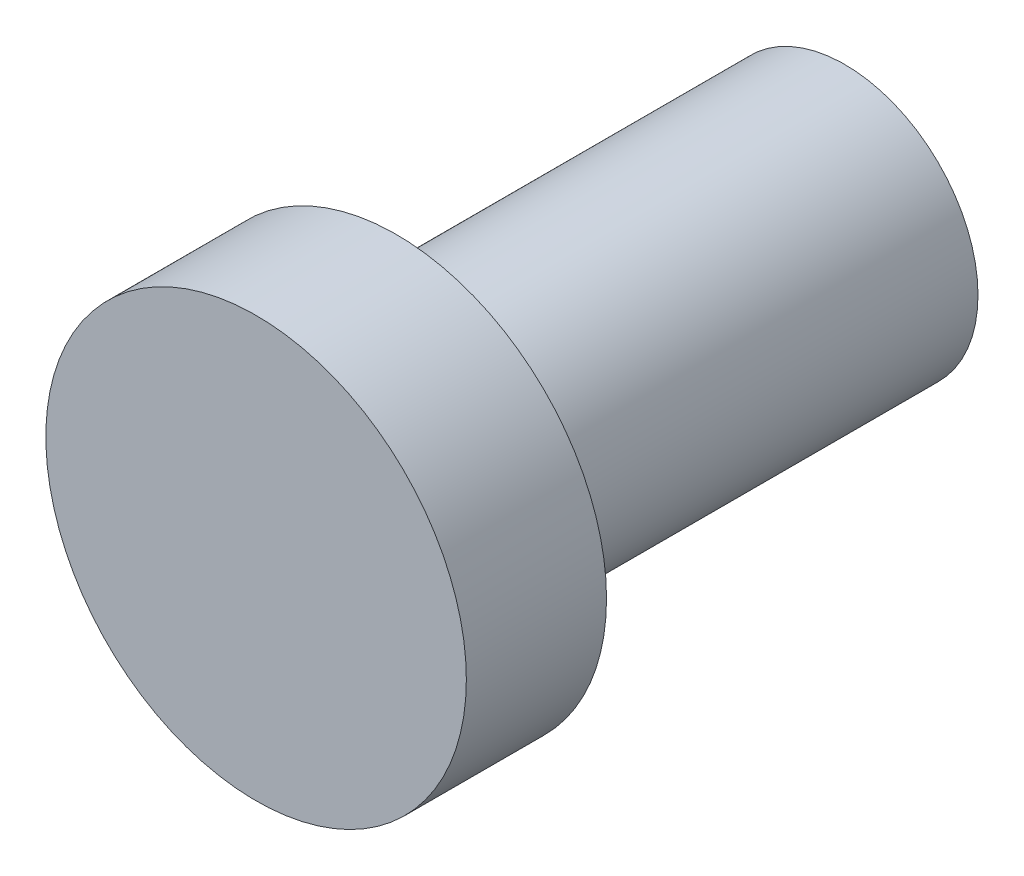
ISO-10303-21;
HEADER;
FILE_DESCRIPTION(('STEP AP214'),'2;1');
FILE_NAME('part.step','',(''),(''),'','','');
FILE_SCHEMA(('AUTOMOTIVE_DESIGN { 1 0 10303 214 1 1 1 1 }'));
ENDSEC;
DATA;
#1=APPLICATION_CONTEXT('core data for automotive mechanical design processes');
#2=APPLICATION_PROTOCOL_DEFINITION('international standard','automotive_design',2000,#1);
#3=PRODUCT_CONTEXT('',#1,'mechanical');
#4=PRODUCT('Part','Part','',(#3));
#5=PRODUCT_RELATED_PRODUCT_CATEGORY('part','',(#4));
#6=PRODUCT_DEFINITION_FORMATION('','',#4);
#7=PRODUCT_DEFINITION_CONTEXT('part definition',#1,'design');
#8=PRODUCT_DEFINITION('design','',#6,#7);
#9=PRODUCT_DEFINITION_SHAPE('','',#8);
#10=(LENGTH_UNIT() NAMED_UNIT(*) SI_UNIT(.MILLI.,.METRE.));
#11=(NAMED_UNIT(*) PLANE_ANGLE_UNIT() SI_UNIT($,.RADIAN.));
#12=(NAMED_UNIT(*) SI_UNIT($,.STERADIAN.) SOLID_ANGLE_UNIT());
#13=UNCERTAINTY_MEASURE_WITH_UNIT(LENGTH_MEASURE(1.E-05),#10,'distance_accuracy_value','');
#14=(GEOMETRIC_REPRESENTATION_CONTEXT(3) GLOBAL_UNCERTAINTY_ASSIGNED_CONTEXT((#13)) GLOBAL_UNIT_ASSIGNED_CONTEXT((#10,
#11,#12)) REPRESENTATION_CONTEXT('',''));
#15=CARTESIAN_POINT('',(0.,0.,0.));
#16=DIRECTION('',(0.,0.,1.));
#17=DIRECTION('',(1.,0.,0.));
#18=AXIS2_PLACEMENT_3D('',#15,#16,#17);
#19=CARTESIAN_POINT('',(0.,0.,16.));
#20=DIRECTION('',(0.,0.,-1.));
#21=DIRECTION('',(-1.,0.,0.));
#22=AXIS2_PLACEMENT_3D('',#19,#20,#21);
#23=CYLINDRICAL_SURFACE('',#22,4.75);
#24=CARTESIAN_POINT('',(0.,0.,16.));
#25=DIRECTION('',(0.,0.,1.));
#26=DIRECTION('',(1.,0.,0.));
#27=AXIS2_PLACEMENT_3D('',#24,#25,#26);
#28=CIRCLE('',#27,4.75);
#29=CARTESIAN_POINT('',(4.75,0.,16.));
#30=VERTEX_POINT('',#29);
#31=EDGE_CURVE('E10',#30,#30,#28,.T.);
#32=ORIENTED_EDGE('',*,*,#31,.F.);
#33=EDGE_LOOP('',(#32));
#34=FACE_BOUND('',#33,.T.);
#35=CARTESIAN_POINT('',(0.,0.,0.));
#36=DIRECTION('',(0.,0.,1.));
#37=DIRECTION('',(1.,0.,0.));
#38=AXIS2_PLACEMENT_3D('',#35,#36,#37);
#39=CIRCLE('',#38,4.75);
#40=CARTESIAN_POINT('',(4.75,0.,0.));
#41=VERTEX_POINT('',#40);
#42=EDGE_CURVE('E33',#41,#41,#39,.T.);
#43=ORIENTED_EDGE('',*,*,#42,.T.);
#44=EDGE_LOOP('',(#43));
#45=FACE_BOUND('',#44,.T.);
#46=ADVANCED_FACE('F30',(#34,#45),#23,.T.);
#47=CARTESIAN_POINT('',(0.,0.,0.));
#48=DIRECTION('',(0.,0.,1.));
#49=DIRECTION('',(1.,0.,0.));
#50=AXIS2_PLACEMENT_3D('',#47,#48,#49);
#51=PLANE('',#50);
#52=CARTESIAN_POINT('',(0.,0.,0.));
#53=DIRECTION('',(0.,0.,-1.));
#54=DIRECTION('',(-1.,0.,0.));
#55=AXIS2_PLACEMENT_3D('',#52,#53,#54);
#56=CIRCLE('',#55,3.5);
#57=CARTESIAN_POINT('',(-3.5,0.,0.));
#58=VERTEX_POINT('',#57);
#59=EDGE_CURVE('E50',#58,#58,#56,.T.);
#60=ORIENTED_EDGE('',*,*,#59,.F.);
#61=EDGE_LOOP('',(#60));
#62=FACE_BOUND('',#61,.T.);
#63=ORIENTED_EDGE('',*,*,#42,.F.);
#64=EDGE_LOOP('',(#63));
#65=FACE_BOUND('',#64,.T.);
#66=ADVANCED_FACE('F56',(#62,#65),#51,.F.);
#67=CARTESIAN_POINT('',(0.,0.,21.));
#68=DIRECTION('',(0.,0.,-1.));
#69=DIRECTION('',(-1.,0.,0.));
#70=AXIS2_PLACEMENT_3D('',#67,#68,#69);
#71=CYLINDRICAL_SURFACE('',#70,7.5);
#72=CARTESIAN_POINT('',(0.,0.,21.));
#73=DIRECTION('',(0.,0.,1.));
#74=DIRECTION('',(1.,0.,0.));
#75=AXIS2_PLACEMENT_3D('',#72,#73,#74);
#76=CIRCLE('',#75,7.5);
#77=CARTESIAN_POINT('',(7.5,0.,21.));
#78=VERTEX_POINT('',#77);
#79=EDGE_CURVE('E40',#78,#78,#76,.T.);
#80=ORIENTED_EDGE('',*,*,#79,.F.);
#81=EDGE_LOOP('',(#80));
#82=FACE_BOUND('',#81,.T.);
#83=CARTESIAN_POINT('',(0.,0.,16.));
#84=DIRECTION('',(0.,0.,1.));
#85=DIRECTION('',(1.,0.,0.));
#86=AXIS2_PLACEMENT_3D('',#83,#84,#85);
#87=CIRCLE('',#86,7.5);
#88=CARTESIAN_POINT('',(7.5,0.,16.));
#89=VERTEX_POINT('',#88);
#90=EDGE_CURVE('E42',#89,#89,#87,.T.);
#91=ORIENTED_EDGE('',*,*,#90,.T.);
#92=EDGE_LOOP('',(#91));
#93=FACE_BOUND('',#92,.T.);
#94=ADVANCED_FACE('F59',(#82,#93),#71,.T.);
#95=CARTESIAN_POINT('',(0.,0.,21.));
#96=DIRECTION('',(0.,0.,1.));
#97=DIRECTION('',(1.,0.,0.));
#98=AXIS2_PLACEMENT_3D('',#95,#96,#97);
#99=PLANE('',#98);
#100=ORIENTED_EDGE('',*,*,#79,.T.);
#101=EDGE_LOOP('',(#100));
#102=FACE_BOUND('',#101,.T.);
#103=ADVANCED_FACE('F81',(#102),#99,.T.);
#104=CARTESIAN_POINT('',(0.,0.,16.));
#105=DIRECTION('',(0.,0.,1.));
#106=DIRECTION('',(1.,0.,0.));
#107=AXIS2_PLACEMENT_3D('',#104,#105,#106);
#108=PLANE('',#107);
#109=ORIENTED_EDGE('',*,*,#31,.T.);
#110=EDGE_LOOP('',(#109));
#111=FACE_BOUND('',#110,.T.);
#112=ORIENTED_EDGE('',*,*,#90,.F.);
#113=EDGE_LOOP('',(#112));
#114=FACE_BOUND('',#113,.T.);
#115=ADVANCED_FACE('F88',(#111,#114),#108,.F.);
#116=CARTESIAN_POINT('',(0.,0.,0.));
#117=DIRECTION('',(0.,0.,-1.));
#118=DIRECTION('',(-1.,0.,0.));
#119=AXIS2_PLACEMENT_3D('',#116,#117,#118);
#120=CONICAL_SURFACE('',#119,3.5,0.10471975511966);
#121=CARTESIAN_POINT('',(0.,0.,12.));
#122=DIRECTION('',(0.,0.,-1.));
#123=DIRECTION('',(-1.,0.,0.));
#124=AXIS2_PLACEMENT_3D('',#121,#122,#123);
#125=CIRCLE('',#124,2.23874917681188);
#126=CARTESIAN_POINT('',(-2.23874917681188,0.,12.));
#127=VERTEX_POINT('',#126);
#128=EDGE_CURVE('E45',#127,#127,#125,.T.);
#129=ORIENTED_EDGE('',*,*,#128,.F.);
#130=EDGE_LOOP('',(#129));
#131=FACE_BOUND('',#130,.T.);
#132=ORIENTED_EDGE('',*,*,#59,.T.);
#133=EDGE_LOOP('',(#132));
#134=FACE_BOUND('',#133,.T.);
#135=ADVANCED_FACE('F54',(#131,#134),#120,.F.);
#136=CARTESIAN_POINT('',(0.,0.,12.));
#137=DIRECTION('',(0.,0.,-1.));
#138=DIRECTION('',(-1.,0.,0.));
#139=AXIS2_PLACEMENT_3D('',#136,#137,#138);
#140=PLANE('',#139);
#141=ORIENTED_EDGE('',*,*,#128,.T.);
#142=EDGE_LOOP('',(#141));
#143=FACE_BOUND('',#142,.T.);
#144=ADVANCED_FACE('F100',(#143),#140,.T.);
#145=CLOSED_SHELL('',(#46,#66,#94,#103,#115,#135,#144));
#146=MANIFOLD_SOLID_BREP('B2',#145);
#147=ADVANCED_BREP_SHAPE_REPRESENTATION('',(#18,#146),#14);
#148=SHAPE_DEFINITION_REPRESENTATION(#9,#147);
ENDSEC;
END-ISO-10303-21;
